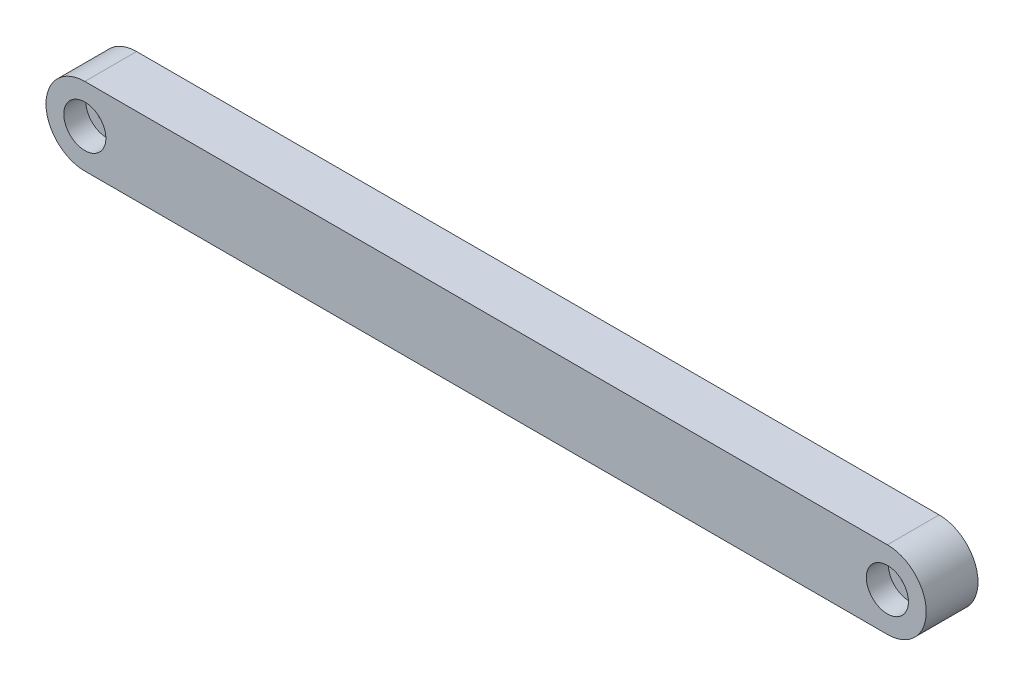
ISO-10303-21;
HEADER;
FILE_DESCRIPTION(('STEP AP214'),'2;1');
FILE_NAME('part.step','',(''),(''),'','','');
FILE_SCHEMA(('AUTOMOTIVE_DESIGN { 1 0 10303 214 1 1 1 1 }'));
ENDSEC;
DATA;
#1=APPLICATION_CONTEXT('core data for automotive mechanical design processes');
#2=APPLICATION_PROTOCOL_DEFINITION('international standard','automotive_design',2000,#1);
#3=PRODUCT_CONTEXT('',#1,'mechanical');
#4=PRODUCT('Part','Part','',(#3));
#5=PRODUCT_RELATED_PRODUCT_CATEGORY('part','',(#4));
#6=PRODUCT_DEFINITION_FORMATION('','',#4);
#7=PRODUCT_DEFINITION_CONTEXT('part definition',#1,'design');
#8=PRODUCT_DEFINITION('design','',#6,#7);
#9=PRODUCT_DEFINITION_SHAPE('','',#8);
#10=(LENGTH_UNIT() NAMED_UNIT(*) SI_UNIT(.MILLI.,.METRE.));
#11=(NAMED_UNIT(*) PLANE_ANGLE_UNIT() SI_UNIT($,.RADIAN.));
#12=(NAMED_UNIT(*) SI_UNIT($,.STERADIAN.) SOLID_ANGLE_UNIT());
#13=UNCERTAINTY_MEASURE_WITH_UNIT(LENGTH_MEASURE(1.E-05),#10,'distance_accuracy_value','');
#14=(GEOMETRIC_REPRESENTATION_CONTEXT(3) GLOBAL_UNCERTAINTY_ASSIGNED_CONTEXT((#13)) GLOBAL_UNIT_ASSIGNED_CONTEXT((#10,
#11,#12)) REPRESENTATION_CONTEXT('',''));
#15=CARTESIAN_POINT('',(0.,0.,0.));
#16=DIRECTION('',(0.,0.,1.));
#17=DIRECTION('',(1.,0.,0.));
#18=AXIS2_PLACEMENT_3D('',#15,#16,#17);
#19=CARTESIAN_POINT('',(-62.,0.,8.));
#20=DIRECTION('',(0.,0.,-1.));
#21=DIRECTION('',(-1.,0.,0.));
#22=AXIS2_PLACEMENT_3D('',#19,#20,#21);
#23=CYLINDRICAL_SURFACE('',#22,6.);
#24=CARTESIAN_POINT('',(-62.,0.,0.));
#25=DIRECTION('',(0.,0.,1.));
#26=DIRECTION('',(1.,0.,0.));
#27=AXIS2_PLACEMENT_3D('',#24,#25,#26);
#28=CIRCLE('',#27,6.);
#29=CARTESIAN_POINT('',(-62.,6.,0.));
#30=VERTEX_POINT('',#29);
#31=CARTESIAN_POINT('',(-62.,-6.,0.));
#32=VERTEX_POINT('',#31);
#33=EDGE_CURVE('E96',#30,#32,#28,.T.);
#34=ORIENTED_EDGE('',*,*,#33,.T.);
#35=DIRECTION('',(0.,0.,-1.));
#36=VECTOR('',#35,1.);
#37=CARTESIAN_POINT('',(-62.,-6.,8.));
#38=LINE('',#37,#36);
#39=CARTESIAN_POINT('',(-62.,-6.,8.));
#40=VERTEX_POINT('',#39);
#41=EDGE_CURVE('E11',#40,#32,#38,.T.);
#42=ORIENTED_EDGE('',*,*,#41,.F.);
#43=CARTESIAN_POINT('',(-62.,0.,8.));
#44=DIRECTION('',(0.,0.,1.));
#45=DIRECTION('',(1.,0.,0.));
#46=AXIS2_PLACEMENT_3D('',#43,#44,#45);
#47=CIRCLE('',#46,6.);
#48=CARTESIAN_POINT('',(-62.,6.,8.));
#49=VERTEX_POINT('',#48);
#50=EDGE_CURVE('E84',#49,#40,#47,.T.);
#51=ORIENTED_EDGE('',*,*,#50,.F.);
#52=DIRECTION('',(0.,0.,-1.));
#53=VECTOR('',#52,1.);
#54=CARTESIAN_POINT('',(-62.,6.,8.));
#55=LINE('',#54,#53);
#56=EDGE_CURVE('E92',#49,#30,#55,.T.);
#57=ORIENTED_EDGE('',*,*,#56,.T.);
#58=EDGE_LOOP('',(#34,#42,#51,#57));
#59=FACE_BOUND('',#58,.T.);
#60=ADVANCED_FACE('F33',(#59),#23,.T.);
#61=CARTESIAN_POINT('',(-62.,-6.,8.));
#62=DIRECTION('',(0.,1.,0.));
#63=DIRECTION('',(-1.,0.,0.));
#64=AXIS2_PLACEMENT_3D('',#61,#62,#63);
#65=PLANE('',#64);
#66=DIRECTION('',(1.,0.,0.));
#67=VECTOR('',#66,1.);
#68=CARTESIAN_POINT('',(-62.,-6.,0.));
#69=LINE('',#68,#67);
#70=CARTESIAN_POINT('',(62.,-5.99999999999998,0.));
#71=VERTEX_POINT('',#70);
#72=EDGE_CURVE('E88',#32,#71,#69,.T.);
#73=ORIENTED_EDGE('',*,*,#72,.T.);
#74=DIRECTION('',(0.,0.,-1.));
#75=VECTOR('',#74,1.);
#76=CARTESIAN_POINT('',(62.,-5.99999999999998,8.));
#77=LINE('',#76,#75);
#78=CARTESIAN_POINT('',(62.,-5.99999999999998,8.));
#79=VERTEX_POINT('',#78);
#80=EDGE_CURVE('E41',#79,#71,#77,.T.);
#81=ORIENTED_EDGE('',*,*,#80,.F.);
#82=DIRECTION('',(1.,0.,0.));
#83=VECTOR('',#82,1.);
#84=CARTESIAN_POINT('',(-62.,-6.,8.));
#85=LINE('',#84,#83);
#86=EDGE_CURVE('E79',#40,#79,#85,.T.);
#87=ORIENTED_EDGE('',*,*,#86,.F.);
#88=ORIENTED_EDGE('',*,*,#41,.T.);
#89=EDGE_LOOP('',(#73,#81,#87,#88));
#90=FACE_BOUND('',#89,.T.);
#91=ADVANCED_FACE('F87',(#90),#65,.F.);
#92=CARTESIAN_POINT('',(62.,0.,8.));
#93=DIRECTION('',(0.,0.,-1.));
#94=DIRECTION('',(-1.,0.,0.));
#95=AXIS2_PLACEMENT_3D('',#92,#93,#94);
#96=CYLINDRICAL_SURFACE('',#95,6.);
#97=CARTESIAN_POINT('',(62.,0.,0.));
#98=DIRECTION('',(0.,0.,1.));
#99=DIRECTION('',(1.,0.,0.));
#100=AXIS2_PLACEMENT_3D('',#97,#98,#99);
#101=CIRCLE('',#100,6.);
#102=CARTESIAN_POINT('',(62.,6.00000000000002,0.));
#103=VERTEX_POINT('',#102);
#104=EDGE_CURVE('E66',#71,#103,#101,.T.);
#105=ORIENTED_EDGE('',*,*,#104,.T.);
#106=DIRECTION('',(0.,0.,-1.));
#107=VECTOR('',#106,1.);
#108=CARTESIAN_POINT('',(62.,6.00000000000002,8.));
#109=LINE('',#108,#107);
#110=CARTESIAN_POINT('',(62.,6.00000000000002,8.));
#111=VERTEX_POINT('',#110);
#112=EDGE_CURVE('E89',#111,#103,#109,.T.);
#113=ORIENTED_EDGE('',*,*,#112,.F.);
#114=CARTESIAN_POINT('',(62.,0.,8.));
#115=DIRECTION('',(0.,0.,1.));
#116=DIRECTION('',(1.,0.,0.));
#117=AXIS2_PLACEMENT_3D('',#114,#115,#116);
#118=CIRCLE('',#117,6.);
#119=EDGE_CURVE('E82',#79,#111,#118,.T.);
#120=ORIENTED_EDGE('',*,*,#119,.F.);
#121=ORIENTED_EDGE('',*,*,#80,.T.);
#122=EDGE_LOOP('',(#105,#113,#120,#121));
#123=FACE_BOUND('',#122,.T.);
#124=ADVANCED_FACE('F90',(#123),#96,.T.);
#125=CARTESIAN_POINT('',(-62.,6.,8.));
#126=DIRECTION('',(0.,-1.,0.));
#127=DIRECTION('',(1.,0.,0.));
#128=AXIS2_PLACEMENT_3D('',#125,#126,#127);
#129=PLANE('',#128);
#130=DIRECTION('',(-1.,0.,0.));
#131=VECTOR('',#130,1.);
#132=CARTESIAN_POINT('',(-62.,6.,0.));
#133=LINE('',#132,#131);
#134=EDGE_CURVE('E72',#103,#30,#133,.T.);
#135=ORIENTED_EDGE('',*,*,#134,.T.);
#136=ORIENTED_EDGE('',*,*,#56,.F.);
#137=DIRECTION('',(-1.,0.,0.));
#138=VECTOR('',#137,1.);
#139=CARTESIAN_POINT('',(-62.,6.,8.));
#140=LINE('',#139,#138);
#141=EDGE_CURVE('E49',#111,#49,#140,.T.);
#142=ORIENTED_EDGE('',*,*,#141,.F.);
#143=ORIENTED_EDGE('',*,*,#112,.T.);
#144=EDGE_LOOP('',(#135,#136,#142,#143));
#145=FACE_BOUND('',#144,.T.);
#146=ADVANCED_FACE('F104',(#145),#129,.F.);
#147=CARTESIAN_POINT('',(-62.,0.,8.));
#148=DIRECTION('',(0.,0.,1.));
#149=DIRECTION('',(1.,0.,0.));
#150=AXIS2_PLACEMENT_3D('',#147,#148,#149);
#151=PLANE('',#150);
#152=CARTESIAN_POINT('',(-62.,0.,8.));
#153=DIRECTION('',(0.,0.,1.));
#154=DIRECTION('',(1.,0.,0.));
#155=AXIS2_PLACEMENT_3D('',#152,#153,#154);
#156=CIRCLE('',#155,3.25);
#157=CARTESIAN_POINT('',(-58.75,0.,8.));
#158=VERTEX_POINT('',#157);
#159=EDGE_CURVE('E130',#158,#158,#156,.T.);
#160=ORIENTED_EDGE('',*,*,#159,.F.);
#161=EDGE_LOOP('',(#160));
#162=FACE_BOUND('',#161,.T.);
#163=CARTESIAN_POINT('',(62.,0.,8.));
#164=DIRECTION('',(0.,0.,1.));
#165=DIRECTION('',(1.,0.,0.));
#166=AXIS2_PLACEMENT_3D('',#163,#164,#165);
#167=CIRCLE('',#166,3.25);
#168=CARTESIAN_POINT('',(65.25,0.,8.));
#169=VERTEX_POINT('',#168);
#170=EDGE_CURVE('E118',#169,#169,#167,.T.);
#171=ORIENTED_EDGE('',*,*,#170,.F.);
#172=EDGE_LOOP('',(#171));
#173=FACE_BOUND('',#172,.T.);
#174=ORIENTED_EDGE('',*,*,#50,.T.);
#175=ORIENTED_EDGE('',*,*,#86,.T.);
#176=ORIENTED_EDGE('',*,*,#119,.T.);
#177=ORIENTED_EDGE('',*,*,#141,.T.);
#178=EDGE_LOOP('',(#174,#175,#176,#177));
#179=FACE_BOUND('',#178,.T.);
#180=ADVANCED_FACE('F80',(#162,#173,#179),#151,.T.);
#181=CARTESIAN_POINT('',(-62.,0.,0.));
#182=DIRECTION('',(0.,0.,1.));
#183=DIRECTION('',(1.,0.,0.));
#184=AXIS2_PLACEMENT_3D('',#181,#182,#183);
#185=PLANE('',#184);
#186=CARTESIAN_POINT('',(-62.,0.,0.));
#187=DIRECTION('',(0.,0.,1.));
#188=DIRECTION('',(1.,0.,0.));
#189=AXIS2_PLACEMENT_3D('',#186,#187,#188);
#190=CIRCLE('',#189,1.6);
#191=CARTESIAN_POINT('',(-60.4,0.,0.));
#192=VERTEX_POINT('',#191);
#193=EDGE_CURVE('E121',#192,#192,#190,.T.);
#194=ORIENTED_EDGE('',*,*,#193,.T.);
#195=EDGE_LOOP('',(#194));
#196=FACE_BOUND('',#195,.T.);
#197=CARTESIAN_POINT('',(62.,0.,0.));
#198=DIRECTION('',(0.,0.,1.));
#199=DIRECTION('',(1.,0.,0.));
#200=AXIS2_PLACEMENT_3D('',#197,#198,#199);
#201=CIRCLE('',#200,1.6);
#202=CARTESIAN_POINT('',(63.6,0.,0.));
#203=VERTEX_POINT('',#202);
#204=EDGE_CURVE('E99',#203,#203,#201,.T.);
#205=ORIENTED_EDGE('',*,*,#204,.T.);
#206=EDGE_LOOP('',(#205));
#207=FACE_BOUND('',#206,.T.);
#208=ORIENTED_EDGE('',*,*,#33,.F.);
#209=ORIENTED_EDGE('',*,*,#134,.F.);
#210=ORIENTED_EDGE('',*,*,#104,.F.);
#211=ORIENTED_EDGE('',*,*,#72,.F.);
#212=EDGE_LOOP('',(#208,#209,#210,#211));
#213=FACE_BOUND('',#212,.T.);
#214=ADVANCED_FACE('F107',(#196,#207,#213),#185,.F.);
#215=CARTESIAN_POINT('',(62.,0.,8.));
#216=DIRECTION('',(0.,0.,1.));
#217=DIRECTION('',(1.,0.,0.));
#218=AXIS2_PLACEMENT_3D('',#215,#216,#217);
#219=CYLINDRICAL_SURFACE('',#218,1.6);
#220=ORIENTED_EDGE('',*,*,#204,.F.);
#221=EDGE_LOOP('',(#220));
#222=FACE_BOUND('',#221,.T.);
#223=CARTESIAN_POINT('',(62.,0.,4.6));
#224=DIRECTION('',(0.,0.,1.));
#225=DIRECTION('',(1.,0.,0.));
#226=AXIS2_PLACEMENT_3D('',#223,#224,#225);
#227=CIRCLE('',#226,1.6);
#228=CARTESIAN_POINT('',(63.6,0.,4.6));
#229=VERTEX_POINT('',#228);
#230=EDGE_CURVE('E112',#229,#229,#227,.T.);
#231=ORIENTED_EDGE('',*,*,#230,.T.);
#232=EDGE_LOOP('',(#231));
#233=FACE_BOUND('',#232,.T.);
#234=ADVANCED_FACE('F154',(#222,#233),#219,.F.);
#235=CARTESIAN_POINT('',(63.6,0.,4.6));
#236=DIRECTION('',(0.,0.,-1.));
#237=DIRECTION('',(-1.,0.,0.));
#238=AXIS2_PLACEMENT_3D('',#235,#236,#237);
#239=PLANE('',#238);
#240=ORIENTED_EDGE('',*,*,#230,.F.);
#241=EDGE_LOOP('',(#240));
#242=FACE_BOUND('',#241,.T.);
#243=CARTESIAN_POINT('',(62.,0.,4.6));
#244=DIRECTION('',(0.,0.,1.));
#245=DIRECTION('',(1.,0.,0.));
#246=AXIS2_PLACEMENT_3D('',#243,#244,#245);
#247=CIRCLE('',#246,3.25);
#248=CARTESIAN_POINT('',(65.25,0.,4.6));
#249=VERTEX_POINT('',#248);
#250=EDGE_CURVE('E115',#249,#249,#247,.T.);
#251=ORIENTED_EDGE('',*,*,#250,.T.);
#252=EDGE_LOOP('',(#251));
#253=FACE_BOUND('',#252,.T.);
#254=ADVANCED_FACE('F144',(#242,#253),#239,.F.);
#255=CARTESIAN_POINT('',(62.,0.,8.));
#256=DIRECTION('',(0.,0.,1.));
#257=DIRECTION('',(1.,0.,0.));
#258=AXIS2_PLACEMENT_3D('',#255,#256,#257);
#259=CYLINDRICAL_SURFACE('',#258,3.25);
#260=ORIENTED_EDGE('',*,*,#250,.F.);
#261=EDGE_LOOP('',(#260));
#262=FACE_BOUND('',#261,.T.);
#263=ORIENTED_EDGE('',*,*,#170,.T.);
#264=EDGE_LOOP('',(#263));
#265=FACE_BOUND('',#264,.T.);
#266=ADVANCED_FACE('F141',(#262,#265),#259,.F.);
#267=CARTESIAN_POINT('',(-62.,0.,8.));
#268=DIRECTION('',(0.,0.,1.));
#269=DIRECTION('',(1.,0.,0.));
#270=AXIS2_PLACEMENT_3D('',#267,#268,#269);
#271=CYLINDRICAL_SURFACE('',#270,1.6);
#272=ORIENTED_EDGE('',*,*,#193,.F.);
#273=EDGE_LOOP('',(#272));
#274=FACE_BOUND('',#273,.T.);
#275=CARTESIAN_POINT('',(-62.,0.,4.6));
#276=DIRECTION('',(0.,0.,1.));
#277=DIRECTION('',(1.,0.,0.));
#278=AXIS2_PLACEMENT_3D('',#275,#276,#277);
#279=CIRCLE('',#278,1.6);
#280=CARTESIAN_POINT('',(-60.4,0.,4.6));
#281=VERTEX_POINT('',#280);
#282=EDGE_CURVE('E124',#281,#281,#279,.T.);
#283=ORIENTED_EDGE('',*,*,#282,.T.);
#284=EDGE_LOOP('',(#283));
#285=FACE_BOUND('',#284,.T.);
#286=ADVANCED_FACE('F143',(#274,#285),#271,.F.);
#287=CARTESIAN_POINT('',(-60.4,0.,4.6));
#288=DIRECTION('',(0.,0.,-1.));
#289=DIRECTION('',(-1.,0.,0.));
#290=AXIS2_PLACEMENT_3D('',#287,#288,#289);
#291=PLANE('',#290);
#292=ORIENTED_EDGE('',*,*,#282,.F.);
#293=EDGE_LOOP('',(#292));
#294=FACE_BOUND('',#293,.T.);
#295=CARTESIAN_POINT('',(-62.,0.,4.6));
#296=DIRECTION('',(0.,0.,1.));
#297=DIRECTION('',(1.,0.,0.));
#298=AXIS2_PLACEMENT_3D('',#295,#296,#297);
#299=CIRCLE('',#298,3.25);
#300=CARTESIAN_POINT('',(-58.75,0.,4.6));
#301=VERTEX_POINT('',#300);
#302=EDGE_CURVE('E127',#301,#301,#299,.T.);
#303=ORIENTED_EDGE('',*,*,#302,.T.);
#304=EDGE_LOOP('',(#303));
#305=FACE_BOUND('',#304,.T.);
#306=ADVANCED_FACE('F151',(#294,#305),#291,.F.);
#307=CARTESIAN_POINT('',(-62.,0.,8.));
#308=DIRECTION('',(0.,0.,1.));
#309=DIRECTION('',(1.,0.,0.));
#310=AXIS2_PLACEMENT_3D('',#307,#308,#309);
#311=CYLINDRICAL_SURFACE('',#310,3.25);
#312=ORIENTED_EDGE('',*,*,#302,.F.);
#313=EDGE_LOOP('',(#312));
#314=FACE_BOUND('',#313,.T.);
#315=ORIENTED_EDGE('',*,*,#159,.T.);
#316=EDGE_LOOP('',(#315));
#317=FACE_BOUND('',#316,.T.);
#318=ADVANCED_FACE('F134',(#314,#317),#311,.F.);
#319=CLOSED_SHELL('',(#60,#91,#124,#146,#180,#214,#234,#254,#266,#286,#306,#318));
#320=MANIFOLD_SOLID_BREP('B2',#319);
#321=ADVANCED_BREP_SHAPE_REPRESENTATION('',(#18,#320),#14);
#322=SHAPE_DEFINITION_REPRESENTATION(#9,#321);
ENDSEC;
END-ISO-10303-21;
